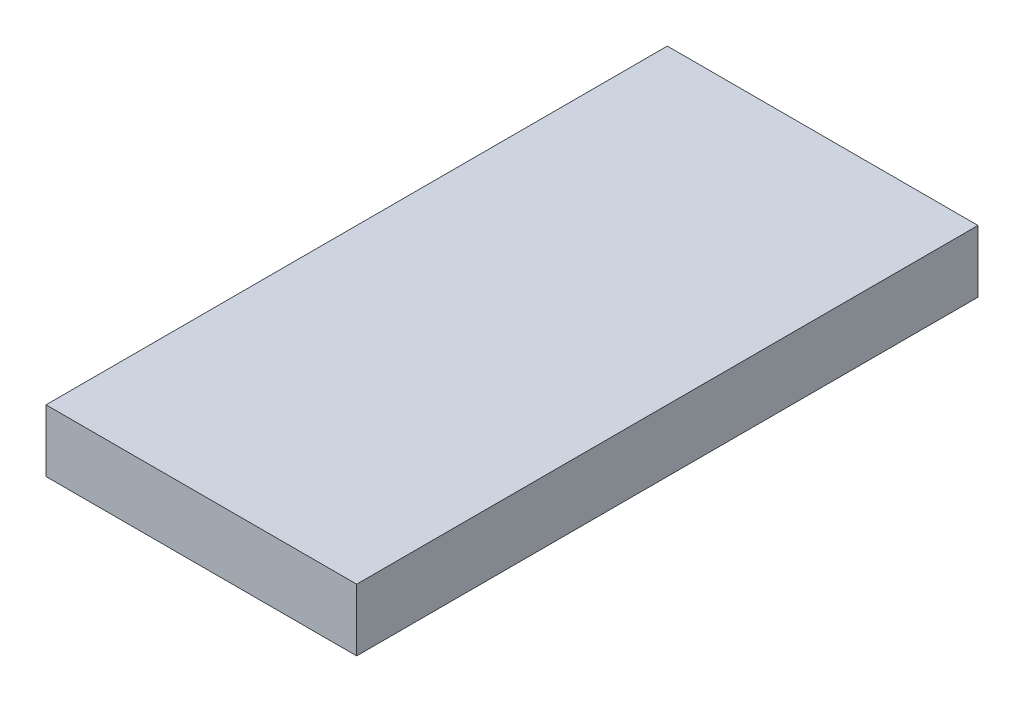
ISO-10303-21;
HEADER;
FILE_DESCRIPTION(('STEP AP214'),'2;1');
FILE_NAME('part.step','',(''),(''),'','','');
FILE_SCHEMA(('AUTOMOTIVE_DESIGN { 1 0 10303 214 1 1 1 1 }'));
ENDSEC;
DATA;
#1=APPLICATION_CONTEXT('core data for automotive mechanical design processes');
#2=APPLICATION_PROTOCOL_DEFINITION('international standard','automotive_design',2000,#1);
#3=PRODUCT_CONTEXT('',#1,'mechanical');
#4=PRODUCT('Part','Part','',(#3));
#5=PRODUCT_RELATED_PRODUCT_CATEGORY('part','',(#4));
#6=PRODUCT_DEFINITION_FORMATION('','',#4);
#7=PRODUCT_DEFINITION_CONTEXT('part definition',#1,'design');
#8=PRODUCT_DEFINITION('design','',#6,#7);
#9=PRODUCT_DEFINITION_SHAPE('','',#8);
#10=(LENGTH_UNIT() NAMED_UNIT(*) SI_UNIT(.MILLI.,.METRE.));
#11=(NAMED_UNIT(*) PLANE_ANGLE_UNIT() SI_UNIT($,.RADIAN.));
#12=(NAMED_UNIT(*) SI_UNIT($,.STERADIAN.) SOLID_ANGLE_UNIT());
#13=UNCERTAINTY_MEASURE_WITH_UNIT(LENGTH_MEASURE(1.E-05),#10,'distance_accuracy_value','');
#14=(GEOMETRIC_REPRESENTATION_CONTEXT(3) GLOBAL_UNCERTAINTY_ASSIGNED_CONTEXT((#13)) GLOBAL_UNIT_ASSIGNED_CONTEXT((#10,
#11,#12)) REPRESENTATION_CONTEXT('',''));
#15=CARTESIAN_POINT('',(0.,0.,0.));
#16=DIRECTION('',(0.,0.,1.));
#17=DIRECTION('',(1.,0.,0.));
#18=AXIS2_PLACEMENT_3D('',#15,#16,#17);
#19=CARTESIAN_POINT('',(60.,6.,0.));
#20=DIRECTION('',(0.,0.,-1.));
#21=DIRECTION('',(-1.,0.,0.));
#22=AXIS2_PLACEMENT_3D('',#19,#20,#21);
#23=PLANE('',#22);
#24=DIRECTION('',(1.,0.,0.));
#25=VECTOR('',#24,1.);
#26=CARTESIAN_POINT('',(60.,-6.,0.));
#27=LINE('',#26,#25);
#28=CARTESIAN_POINT('',(0.,-6.,0.));
#29=VERTEX_POINT('',#28);
#30=CARTESIAN_POINT('',(60.,-6.,0.));
#31=VERTEX_POINT('',#30);
#32=EDGE_CURVE('E99',#29,#31,#27,.T.);
#33=ORIENTED_EDGE('',*,*,#32,.T.);
#34=DIRECTION('',(0.,-1.,0.));
#35=VECTOR('',#34,1.);
#36=CARTESIAN_POINT('',(60.,6.,0.));
#37=LINE('',#36,#35);
#38=CARTESIAN_POINT('',(60.,6.,0.));
#39=VERTEX_POINT('',#38);
#40=EDGE_CURVE('E11',#39,#31,#37,.T.);
#41=ORIENTED_EDGE('',*,*,#40,.F.);
#42=DIRECTION('',(1.,0.,0.));
#43=VECTOR('',#42,1.);
#44=CARTESIAN_POINT('',(60.,6.,0.));
#45=LINE('',#44,#43);
#46=CARTESIAN_POINT('',(0.,6.,0.));
#47=VERTEX_POINT('',#46);
#48=EDGE_CURVE('E87',#47,#39,#45,.T.);
#49=ORIENTED_EDGE('',*,*,#48,.F.);
#50=DIRECTION('',(0.,-1.,0.));
#51=VECTOR('',#50,1.);
#52=CARTESIAN_POINT('',(0.,6.,0.));
#53=LINE('',#52,#51);
#54=EDGE_CURVE('E95',#47,#29,#53,.T.);
#55=ORIENTED_EDGE('',*,*,#54,.T.);
#56=EDGE_LOOP('',(#33,#41,#49,#55));
#57=FACE_BOUND('',#56,.T.);
#58=ADVANCED_FACE('F36',(#57),#23,.F.);
#59=CARTESIAN_POINT('',(60.,6.,-120.));
#60=DIRECTION('',(-1.,0.,0.));
#61=DIRECTION('',(0.,0.,1.));
#62=AXIS2_PLACEMENT_3D('',#59,#60,#61);
#63=PLANE('',#62);
#64=DIRECTION('',(0.,0.,-1.));
#65=VECTOR('',#64,1.);
#66=CARTESIAN_POINT('',(60.,-6.,-120.));
#67=LINE('',#66,#65);
#68=CARTESIAN_POINT('',(60.,-6.,-120.));
#69=VERTEX_POINT('',#68);
#70=EDGE_CURVE('E91',#31,#69,#67,.T.);
#71=ORIENTED_EDGE('',*,*,#70,.T.);
#72=DIRECTION('',(0.,-1.,0.));
#73=VECTOR('',#72,1.);
#74=CARTESIAN_POINT('',(60.,6.,-120.));
#75=LINE('',#74,#73);
#76=CARTESIAN_POINT('',(60.,6.,-120.));
#77=VERTEX_POINT('',#76);
#78=EDGE_CURVE('E44',#77,#69,#75,.T.);
#79=ORIENTED_EDGE('',*,*,#78,.F.);
#80=DIRECTION('',(0.,0.,-1.));
#81=VECTOR('',#80,1.);
#82=CARTESIAN_POINT('',(60.,6.,-120.));
#83=LINE('',#82,#81);
#84=EDGE_CURVE('E82',#39,#77,#83,.T.);
#85=ORIENTED_EDGE('',*,*,#84,.F.);
#86=ORIENTED_EDGE('',*,*,#40,.T.);
#87=EDGE_LOOP('',(#71,#79,#85,#86));
#88=FACE_BOUND('',#87,.T.);
#89=ADVANCED_FACE('F90',(#88),#63,.F.);
#90=CARTESIAN_POINT('',(0.,6.,-120.));
#91=DIRECTION('',(0.,0.,1.));
#92=DIRECTION('',(1.,0.,0.));
#93=AXIS2_PLACEMENT_3D('',#90,#91,#92);
#94=PLANE('',#93);
#95=DIRECTION('',(-1.,0.,0.));
#96=VECTOR('',#95,1.);
#97=CARTESIAN_POINT('',(0.,-6.,-120.));
#98=LINE('',#97,#96);
#99=CARTESIAN_POINT('',(0.,-6.,-120.));
#100=VERTEX_POINT('',#99);
#101=EDGE_CURVE('E69',#69,#100,#98,.T.);
#102=ORIENTED_EDGE('',*,*,#101,.T.);
#103=DIRECTION('',(0.,-1.,0.));
#104=VECTOR('',#103,1.);
#105=CARTESIAN_POINT('',(0.,6.,-120.));
#106=LINE('',#105,#104);
#107=CARTESIAN_POINT('',(0.,6.,-120.));
#108=VERTEX_POINT('',#107);
#109=EDGE_CURVE('E92',#108,#100,#106,.T.);
#110=ORIENTED_EDGE('',*,*,#109,.F.);
#111=DIRECTION('',(-1.,0.,0.));
#112=VECTOR('',#111,1.);
#113=CARTESIAN_POINT('',(0.,6.,-120.));
#114=LINE('',#113,#112);
#115=EDGE_CURVE('E85',#77,#108,#114,.T.);
#116=ORIENTED_EDGE('',*,*,#115,.F.);
#117=ORIENTED_EDGE('',*,*,#78,.T.);
#118=EDGE_LOOP('',(#102,#110,#116,#117));
#119=FACE_BOUND('',#118,.T.);
#120=ADVANCED_FACE('F93',(#119),#94,.F.);
#121=CARTESIAN_POINT('',(0.,6.,0.));
#122=DIRECTION('',(1.,0.,0.));
#123=DIRECTION('',(0.,0.,-1.));
#124=AXIS2_PLACEMENT_3D('',#121,#122,#123);
#125=PLANE('',#124);
#126=DIRECTION('',(0.,0.,1.));
#127=VECTOR('',#126,1.);
#128=CARTESIAN_POINT('',(0.,-6.,0.));
#129=LINE('',#128,#127);
#130=EDGE_CURVE('E75',#100,#29,#129,.T.);
#131=ORIENTED_EDGE('',*,*,#130,.T.);
#132=ORIENTED_EDGE('',*,*,#54,.F.);
#133=DIRECTION('',(0.,0.,1.));
#134=VECTOR('',#133,1.);
#135=CARTESIAN_POINT('',(0.,6.,0.));
#136=LINE('',#135,#134);
#137=EDGE_CURVE('E52',#108,#47,#136,.T.);
#138=ORIENTED_EDGE('',*,*,#137,.F.);
#139=ORIENTED_EDGE('',*,*,#109,.T.);
#140=EDGE_LOOP('',(#131,#132,#138,#139));
#141=FACE_BOUND('',#140,.T.);
#142=ADVANCED_FACE('F106',(#141),#125,.F.);
#143=CARTESIAN_POINT('',(0.,6.,0.));
#144=DIRECTION('',(0.,-1.,0.));
#145=DIRECTION('',(0.,0.,-1.));
#146=AXIS2_PLACEMENT_3D('',#143,#144,#145);
#147=PLANE('',#146);
#148=ORIENTED_EDGE('',*,*,#48,.T.);
#149=ORIENTED_EDGE('',*,*,#84,.T.);
#150=ORIENTED_EDGE('',*,*,#115,.T.);
#151=ORIENTED_EDGE('',*,*,#137,.T.);
#152=EDGE_LOOP('',(#148,#149,#150,#151));
#153=FACE_BOUND('',#152,.T.);
#154=ADVANCED_FACE('F83',(#153),#147,.F.);
#155=CARTESIAN_POINT('',(0.,-6.,0.));
#156=DIRECTION('',(0.,-1.,0.));
#157=DIRECTION('',(0.,0.,-1.));
#158=AXIS2_PLACEMENT_3D('',#155,#156,#157);
#159=PLANE('',#158);
#160=ORIENTED_EDGE('',*,*,#32,.F.);
#161=ORIENTED_EDGE('',*,*,#130,.F.);
#162=ORIENTED_EDGE('',*,*,#101,.F.);
#163=ORIENTED_EDGE('',*,*,#70,.F.);
#164=EDGE_LOOP('',(#160,#161,#162,#163));
#165=FACE_BOUND('',#164,.T.);
#166=ADVANCED_FACE('F109',(#165),#159,.T.);
#167=CLOSED_SHELL('',(#58,#89,#120,#142,#154,#166));
#168=MANIFOLD_SOLID_BREP('B2',#167);
#169=ADVANCED_BREP_SHAPE_REPRESENTATION('',(#18,#168),#14);
#170=SHAPE_DEFINITION_REPRESENTATION(#9,#169);
ENDSEC;
END-ISO-10303-21;
